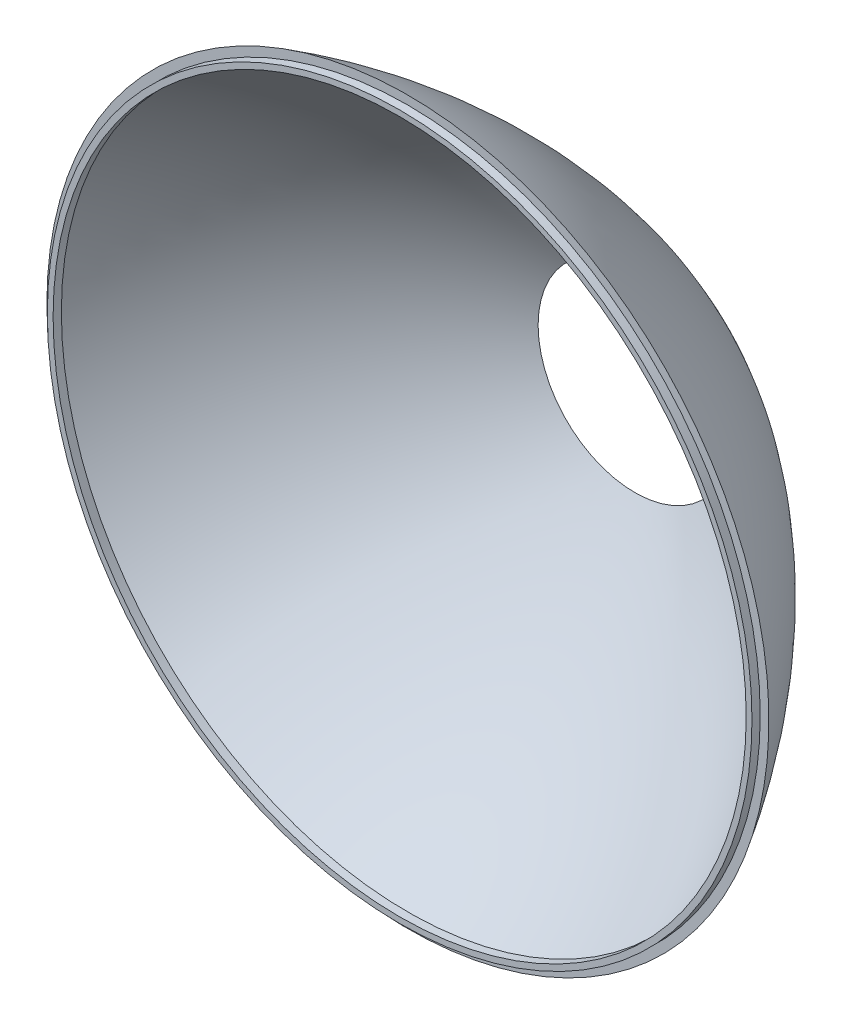
ISO-10303-21;
HEADER;
FILE_DESCRIPTION(('STEP AP214'),'2;1');
FILE_NAME('part.step','',(''),(''),'','','');
FILE_SCHEMA(('AUTOMOTIVE_DESIGN { 1 0 10303 214 1 1 1 1 }'));
ENDSEC;
DATA;
#1=APPLICATION_CONTEXT('core data for automotive mechanical design processes');
#2=APPLICATION_PROTOCOL_DEFINITION('international standard','automotive_design',2000,#1);
#3=PRODUCT_CONTEXT('',#1,'mechanical');
#4=PRODUCT('Part','Part','',(#3));
#5=PRODUCT_RELATED_PRODUCT_CATEGORY('part','',(#4));
#6=PRODUCT_DEFINITION_FORMATION('','',#4);
#7=PRODUCT_DEFINITION_CONTEXT('part definition',#1,'design');
#8=PRODUCT_DEFINITION('design','',#6,#7);
#9=PRODUCT_DEFINITION_SHAPE('','',#8);
#10=(LENGTH_UNIT() NAMED_UNIT(*) SI_UNIT(.MILLI.,.METRE.));
#11=(NAMED_UNIT(*) PLANE_ANGLE_UNIT() SI_UNIT($,.RADIAN.));
#12=(NAMED_UNIT(*) SI_UNIT($,.STERADIAN.) SOLID_ANGLE_UNIT());
#13=UNCERTAINTY_MEASURE_WITH_UNIT(LENGTH_MEASURE(1.E-05),#10,'distance_accuracy_value','');
#14=(GEOMETRIC_REPRESENTATION_CONTEXT(3) GLOBAL_UNCERTAINTY_ASSIGNED_CONTEXT((#13)) GLOBAL_UNIT_ASSIGNED_CONTEXT((#10,
#11,#12)) REPRESENTATION_CONTEXT('',''));
#15=CARTESIAN_POINT('',(0.,0.,0.));
#16=DIRECTION('',(0.,0.,1.));
#17=DIRECTION('',(1.,0.,0.));
#18=AXIS2_PLACEMENT_3D('',#15,#16,#17);
#19=CARTESIAN_POINT('',(87.5,0.,0.));
#20=DIRECTION('',(0.,0.,-1.));
#21=DIRECTION('',(-1.,0.,0.));
#22=AXIS2_PLACEMENT_3D('',#19,#20,#21);
#23=PLANE('',#22);
#24=CARTESIAN_POINT('',(0.,0.,0.));
#25=DIRECTION('',(0.,0.,-1.));
#26=DIRECTION('',(-1.,0.,0.));
#27=AXIS2_PLACEMENT_3D('',#24,#25,#26);
#28=CIRCLE('',#27,87.5);
#29=CARTESIAN_POINT('',(-87.5,0.,0.));
#30=VERTEX_POINT('',#29);
#31=EDGE_CURVE('E42',#30,#30,#28,.T.);
#32=ORIENTED_EDGE('',*,*,#31,.F.);
#33=EDGE_LOOP('',(#32));
#34=FACE_BOUND('',#33,.T.);
#35=CARTESIAN_POINT('',(0.,0.,0.));
#36=DIRECTION('',(0.,0.,-1.));
#37=DIRECTION('',(-1.,0.,0.));
#38=AXIS2_PLACEMENT_3D('',#35,#36,#37);
#39=CIRCLE('',#38,85.3911746442941);
#40=CARTESIAN_POINT('',(-85.3911746442941,0.,0.));
#41=VERTEX_POINT('',#40);
#42=EDGE_CURVE('E10',#41,#41,#39,.F.);
#43=ORIENTED_EDGE('',*,*,#42,.F.);
#44=EDGE_LOOP('',(#43));
#45=FACE_BOUND('',#44,.T.);
#46=ADVANCED_FACE('F35',(#34,#45),#23,.F.);
#47=CARTESIAN_POINT('',(0.,0.,77.0140694274804));
#48=DIRECTION('',(0.,0.,-1.));
#49=DIRECTION('',(-1.,0.,0.));
#50=AXIS2_PLACEMENT_3D('',#47,#48,#49);
#51=DEGENERATE_TOROIDAL_SURFACE('',#50,41.2199794523726,150.,.F.);
#52=CARTESIAN_POINT('',(0.,0.,-55.));
#53=DIRECTION('',(0.,0.,-1.));
#54=DIRECTION('',(-1.,0.,0.));
#55=AXIS2_PLACEMENT_3D('',#52,#53,#54);
#56=CIRCLE('',#55,30.);
#57=CARTESIAN_POINT('',(-30.,0.,-55.));
#58=VERTEX_POINT('',#57);
#59=EDGE_CURVE('E55',#58,#58,#56,.T.);
#60=ORIENTED_EDGE('',*,*,#59,.F.);
#61=EDGE_LOOP('',(#60));
#62=FACE_BOUND('',#61,.T.);
#63=ORIENTED_EDGE('',*,*,#31,.T.);
#64=EDGE_LOOP('',(#63));
#65=FACE_BOUND('',#64,.T.);
#66=ADVANCED_FACE('F37',(#62,#65),#51,.F.);
#67=CARTESIAN_POINT('',(0.,0.,77.0140694274804));
#68=DIRECTION('',(0.,0.,-1.));
#69=DIRECTION('',(-1.,0.,0.));
#70=AXIS2_PLACEMENT_3D('',#67,#68,#69);
#71=DEGENERATE_TOROIDAL_SURFACE('',#70,41.2199794523726,147.,.F.);
#72=CARTESIAN_POINT('',(0.,0.,0.));
#73=DIRECTION('',(0.,0.,-1.));
#74=DIRECTION('',(-1.,0.,0.));
#75=AXIS2_PLACEMENT_3D('',#72,#73,#74);
#76=CIRCLE('',#75,83.9911746442941);
#77=CARTESIAN_POINT('',(-83.9911746442941,0.,0.));
#78=VERTEX_POINT('',#77);
#79=EDGE_CURVE('E46',#78,#78,#76,.T.);
#80=ORIENTED_EDGE('',*,*,#79,.F.);
#81=EDGE_LOOP('',(#80));
#82=FACE_BOUND('',#81,.T.);
#83=CARTESIAN_POINT('',(0.,0.,-55.));
#84=DIRECTION('',(0.,0.,-1.));
#85=DIRECTION('',(-1.,0.,0.));
#86=AXIS2_PLACEMENT_3D('',#83,#84,#85);
#87=CIRCLE('',#86,23.4428806235348);
#88=CARTESIAN_POINT('',(-23.4428806235348,0.,-55.));
#89=VERTEX_POINT('',#88);
#90=EDGE_CURVE('E50',#89,#89,#87,.T.);
#91=ORIENTED_EDGE('',*,*,#90,.T.);
#92=EDGE_LOOP('',(#91));
#93=FACE_BOUND('',#92,.T.);
#94=ADVANCED_FACE('F80',(#82,#93),#71,.T.);
#95=CARTESIAN_POINT('',(30.,0.,-55.));
#96=DIRECTION('',(0.,0.,1.));
#97=DIRECTION('',(1.,0.,0.));
#98=AXIS2_PLACEMENT_3D('',#95,#96,#97);
#99=PLANE('',#98);
#100=ORIENTED_EDGE('',*,*,#90,.F.);
#101=EDGE_LOOP('',(#100));
#102=FACE_BOUND('',#101,.T.);
#103=ORIENTED_EDGE('',*,*,#59,.T.);
#104=EDGE_LOOP('',(#103));
#105=FACE_BOUND('',#104,.T.);
#106=ADVANCED_FACE('F71',(#102,#105),#99,.F.);
#107=CARTESIAN_POINT('',(0.,0.,2.));
#108=DIRECTION('',(0.,0.,1.));
#109=DIRECTION('',(1.,0.,0.));
#110=AXIS2_PLACEMENT_3D('',#107,#108,#109);
#111=PLANE('',#110);
#112=CARTESIAN_POINT('',(0.,0.,2.));
#113=DIRECTION('',(0.,0.,1.));
#114=DIRECTION('',(1.,0.,0.));
#115=AXIS2_PLACEMENT_3D('',#112,#113,#114);
#116=CIRCLE('',#115,85.3911746442941);
#117=CARTESIAN_POINT('',(85.3911746442941,0.,2.));
#118=VERTEX_POINT('',#117);
#119=EDGE_CURVE('E58',#118,#118,#116,.T.);
#120=ORIENTED_EDGE('',*,*,#119,.T.);
#121=EDGE_LOOP('',(#120));
#122=FACE_BOUND('',#121,.T.);
#123=CARTESIAN_POINT('',(0.,0.,2.));
#124=DIRECTION('',(0.,0.,1.));
#125=DIRECTION('',(1.,0.,0.));
#126=AXIS2_PLACEMENT_3D('',#123,#124,#125);
#127=CIRCLE('',#126,83.9911746442941);
#128=CARTESIAN_POINT('',(83.9911746442941,0.,2.));
#129=VERTEX_POINT('',#128);
#130=EDGE_CURVE('E61',#129,#129,#127,.T.);
#131=ORIENTED_EDGE('',*,*,#130,.F.);
#132=EDGE_LOOP('',(#131));
#133=FACE_BOUND('',#132,.T.);
#134=ADVANCED_FACE('F68',(#122,#133),#111,.T.);
#135=CARTESIAN_POINT('',(0.,0.,2.));
#136=DIRECTION('',(0.,0.,-1.));
#137=DIRECTION('',(-1.,0.,0.));
#138=AXIS2_PLACEMENT_3D('',#135,#136,#137);
#139=CYLINDRICAL_SURFACE('',#138,85.3911746442941);
#140=ORIENTED_EDGE('',*,*,#119,.F.);
#141=EDGE_LOOP('',(#140));
#142=FACE_BOUND('',#141,.T.);
#143=ORIENTED_EDGE('',*,*,#42,.T.);
#144=EDGE_LOOP('',(#143));
#145=FACE_BOUND('',#144,.T.);
#146=ADVANCED_FACE('F70',(#142,#145),#139,.T.);
#147=CARTESIAN_POINT('',(0.,0.,2.));
#148=DIRECTION('',(0.,0.,-1.));
#149=DIRECTION('',(-1.,0.,0.));
#150=AXIS2_PLACEMENT_3D('',#147,#148,#149);
#151=CYLINDRICAL_SURFACE('',#150,83.9911746442941);
#152=ORIENTED_EDGE('',*,*,#130,.T.);
#153=EDGE_LOOP('',(#152));
#154=FACE_BOUND('',#153,.T.);
#155=ORIENTED_EDGE('',*,*,#79,.T.);
#156=EDGE_LOOP('',(#155));
#157=FACE_BOUND('',#156,.T.);
#158=ADVANCED_FACE('F65',(#154,#157),#151,.F.);
#159=CLOSED_SHELL('',(#46,#66,#94,#106,#134,#146,#158));
#160=MANIFOLD_SOLID_BREP('B2',#159);
#161=ADVANCED_BREP_SHAPE_REPRESENTATION('',(#18,#160),#14);
#162=SHAPE_DEFINITION_REPRESENTATION(#9,#161);
ENDSEC;
END-ISO-10303-21;
